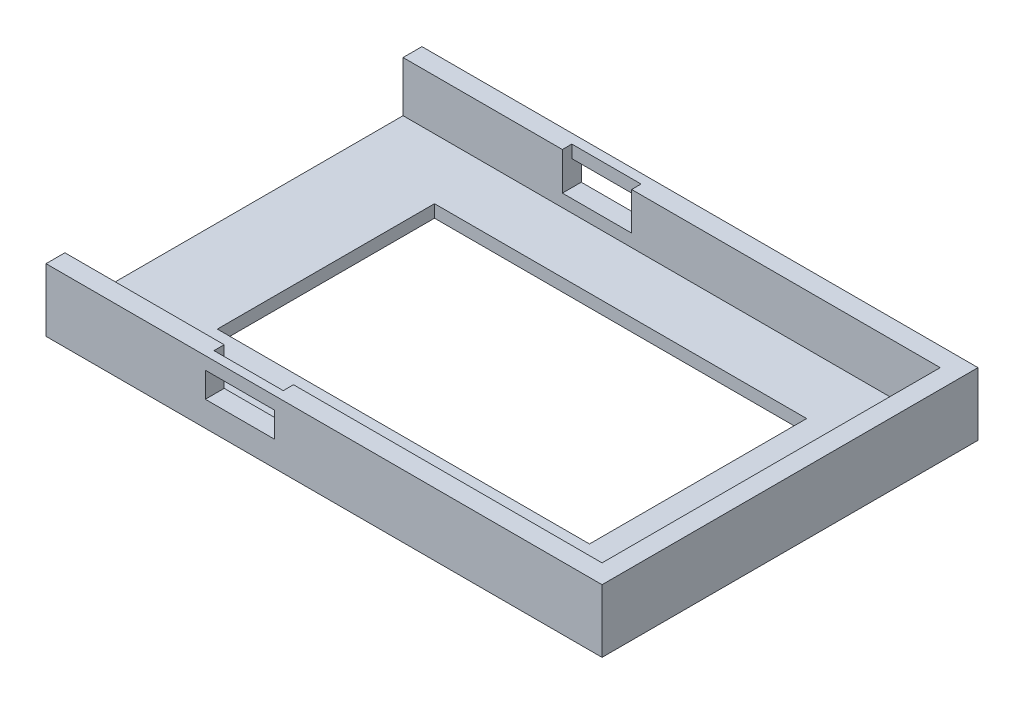
ISO-10303-21;
HEADER;
FILE_DESCRIPTION(('STEP AP214'),'2;1');
FILE_NAME('part.step','',(''),(''),'','','');
FILE_SCHEMA(('AUTOMOTIVE_DESIGN { 1 0 10303 214 1 1 1 1 }'));
ENDSEC;
DATA;
#1=APPLICATION_CONTEXT('core data for automotive mechanical design processes');
#2=APPLICATION_PROTOCOL_DEFINITION('international standard','automotive_design',2000,#1);
#3=PRODUCT_CONTEXT('',#1,'mechanical');
#4=PRODUCT('Part','Part','',(#3));
#5=PRODUCT_RELATED_PRODUCT_CATEGORY('part','',(#4));
#6=PRODUCT_DEFINITION_FORMATION('','',#4);
#7=PRODUCT_DEFINITION_CONTEXT('part definition',#1,'design');
#8=PRODUCT_DEFINITION('design','',#6,#7);
#9=PRODUCT_DEFINITION_SHAPE('','',#8);
#10=(LENGTH_UNIT() NAMED_UNIT(*) SI_UNIT(.MILLI.,.METRE.));
#11=(NAMED_UNIT(*) PLANE_ANGLE_UNIT() SI_UNIT($,.RADIAN.));
#12=(NAMED_UNIT(*) SI_UNIT($,.STERADIAN.) SOLID_ANGLE_UNIT());
#13=UNCERTAINTY_MEASURE_WITH_UNIT(LENGTH_MEASURE(1.E-05),#10,'distance_accuracy_value','');
#14=(GEOMETRIC_REPRESENTATION_CONTEXT(3) GLOBAL_UNCERTAINTY_ASSIGNED_CONTEXT((#13)) GLOBAL_UNIT_ASSIGNED_CONTEXT((#10,
#11,#12)) REPRESENTATION_CONTEXT('',''));
#15=CARTESIAN_POINT('',(0.,0.,0.));
#16=DIRECTION('',(0.,0.,1.));
#17=DIRECTION('',(1.,0.,0.));
#18=AXIS2_PLACEMENT_3D('',#15,#16,#17);
#19=CARTESIAN_POINT('',(-7.84999999999998,2.,-26.85));
#20=DIRECTION('',(1.,0.,0.));
#21=DIRECTION('',(0.,0.,-1.));
#22=AXIS2_PLACEMENT_3D('',#19,#20,#21);
#23=PLANE('',#22);
#24=DIRECTION('',(0.,1.,0.));
#25=VECTOR('',#24,1.);
#26=CARTESIAN_POINT('',(-7.84999999999998,8.,-28.35));
#27=LINE('',#26,#25);
#28=CARTESIAN_POINT('',(-7.84999999999998,6.,-28.35));
#29=VERTEX_POINT('',#28);
#30=CARTESIAN_POINT('',(-7.84999999999998,8.,-28.35));
#31=VERTEX_POINT('',#30);
#32=EDGE_CURVE('E211',#29,#31,#27,.T.);
#33=ORIENTED_EDGE('',*,*,#32,.F.);
#34=DIRECTION('',(0.,0.,1.));
#35=VECTOR('',#34,1.);
#36=CARTESIAN_POINT('',(-7.84999999999998,6.,-29.85));
#37=LINE('',#36,#35);
#38=CARTESIAN_POINT('',(-7.84999999999998,6.,-29.85));
#39=VERTEX_POINT('',#38);
#40=EDGE_CURVE('E220',#39,#29,#37,.T.);
#41=ORIENTED_EDGE('',*,*,#40,.F.);
#42=DIRECTION('',(0.,1.,0.));
#43=VECTOR('',#42,1.);
#44=CARTESIAN_POINT('',(-7.84999999999998,2.,-29.85));
#45=LINE('',#44,#43);
#46=CARTESIAN_POINT('',(-7.84999999999998,2.,-29.85));
#47=VERTEX_POINT('',#46);
#48=EDGE_CURVE('E237',#47,#39,#45,.T.);
#49=ORIENTED_EDGE('',*,*,#48,.F.);
#50=DIRECTION('',(0.,0.,-1.));
#51=VECTOR('',#50,1.);
#52=CARTESIAN_POINT('',(-7.84999999999998,2.,-26.85));
#53=LINE('',#52,#51);
#54=CARTESIAN_POINT('',(-7.84999999999998,2.,-26.85));
#55=VERTEX_POINT('',#54);
#56=EDGE_CURVE('E250',#55,#47,#53,.T.);
#57=ORIENTED_EDGE('',*,*,#56,.F.);
#58=DIRECTION('',(0.,1.,0.));
#59=VECTOR('',#58,1.);
#60=CARTESIAN_POINT('',(-7.84999999999998,2.,-26.85));
#61=LINE('',#60,#59);
#62=CARTESIAN_POINT('',(-7.84999999999998,8.,-26.85));
#63=VERTEX_POINT('',#62);
#64=EDGE_CURVE('E224',#55,#63,#61,.T.);
#65=ORIENTED_EDGE('',*,*,#64,.T.);
#66=DIRECTION('',(0.,0.,-1.));
#67=VECTOR('',#66,1.);
#68=CARTESIAN_POINT('',(-7.84999999999998,8.,-26.85));
#69=LINE('',#68,#67);
#70=EDGE_CURVE('E204',#63,#31,#69,.T.);
#71=ORIENTED_EDGE('',*,*,#70,.T.);
#72=EDGE_LOOP('',(#33,#41,#49,#57,#65,#71));
#73=FACE_BOUND('',#72,.T.);
#74=ADVANCED_FACE('F39',(#73),#23,.F.);
#75=CARTESIAN_POINT('',(-18.85,2.,-29.85));
#76=DIRECTION('',(-1.,0.,0.));
#77=DIRECTION('',(0.,0.,1.));
#78=AXIS2_PLACEMENT_3D('',#75,#76,#77);
#79=PLANE('',#78);
#80=DIRECTION('',(0.,1.,0.));
#81=VECTOR('',#80,1.);
#82=CARTESIAN_POINT('',(-18.85,8.,-28.35));
#83=LINE('',#82,#81);
#84=CARTESIAN_POINT('',(-18.85,6.,-28.35));
#85=VERTEX_POINT('',#84);
#86=CARTESIAN_POINT('',(-18.85,8.,-28.35));
#87=VERTEX_POINT('',#86);
#88=EDGE_CURVE('E451',#85,#87,#83,.T.);
#89=ORIENTED_EDGE('',*,*,#88,.T.);
#90=DIRECTION('',(0.,0.,1.));
#91=VECTOR('',#90,1.);
#92=CARTESIAN_POINT('',(-18.85,8.,-29.85));
#93=LINE('',#92,#91);
#94=CARTESIAN_POINT('',(-18.85,8.,-26.85));
#95=VERTEX_POINT('',#94);
#96=EDGE_CURVE('E207',#87,#95,#93,.T.);
#97=ORIENTED_EDGE('',*,*,#96,.T.);
#98=DIRECTION('',(0.,1.,0.));
#99=VECTOR('',#98,1.);
#100=CARTESIAN_POINT('',(-18.85,2.,-26.85));
#101=LINE('',#100,#99);
#102=CARTESIAN_POINT('',(-18.85,2.,-26.85));
#103=VERTEX_POINT('',#102);
#104=EDGE_CURVE('E244',#103,#95,#101,.T.);
#105=ORIENTED_EDGE('',*,*,#104,.F.);
#106=DIRECTION('',(0.,0.,1.));
#107=VECTOR('',#106,1.);
#108=CARTESIAN_POINT('',(-18.85,2.,-29.85));
#109=LINE('',#108,#107);
#110=CARTESIAN_POINT('',(-18.85,2.,-29.85));
#111=VERTEX_POINT('',#110);
#112=EDGE_CURVE('E231',#111,#103,#109,.T.);
#113=ORIENTED_EDGE('',*,*,#112,.F.);
#114=DIRECTION('',(0.,1.,0.));
#115=VECTOR('',#114,1.);
#116=CARTESIAN_POINT('',(-18.85,2.,-29.85));
#117=LINE('',#116,#115);
#118=CARTESIAN_POINT('',(-18.85,6.,-29.85));
#119=VERTEX_POINT('',#118);
#120=EDGE_CURVE('E60',#111,#119,#117,.T.);
#121=ORIENTED_EDGE('',*,*,#120,.T.);
#122=DIRECTION('',(0.,0.,1.));
#123=VECTOR('',#122,1.);
#124=CARTESIAN_POINT('',(-18.85,6.,-29.8499999999999));
#125=LINE('',#124,#123);
#126=EDGE_CURVE('E55',#119,#85,#125,.T.);
#127=ORIENTED_EDGE('',*,*,#126,.T.);
#128=EDGE_LOOP('',(#89,#97,#105,#113,#121,#127));
#129=FACE_BOUND('',#128,.T.);
#130=ADVANCED_FACE('F519',(#129),#79,.F.);
#131=CARTESIAN_POINT('',(-7.84999999999998,2.,26.85));
#132=DIRECTION('',(1.,0.,0.));
#133=DIRECTION('',(0.,0.,-1.));
#134=AXIS2_PLACEMENT_3D('',#131,#132,#133);
#135=PLANE('',#134);
#136=DIRECTION('',(0.,-1.,0.));
#137=VECTOR('',#136,1.);
#138=CARTESIAN_POINT('',(-7.84999999999998,8.,28.4745612654689));
#139=LINE('',#138,#137);
#140=CARTESIAN_POINT('',(-7.84999999999998,8.,28.4745612654689));
#141=VERTEX_POINT('',#140);
#142=CARTESIAN_POINT('',(-7.84999999999998,6.,28.4745612654689));
#143=VERTEX_POINT('',#142);
#144=EDGE_CURVE('E457',#141,#143,#139,.T.);
#145=ORIENTED_EDGE('',*,*,#144,.F.);
#146=DIRECTION('',(0.,0.,-1.));
#147=VECTOR('',#146,1.);
#148=CARTESIAN_POINT('',(-7.84999999999998,8.,26.85));
#149=LINE('',#148,#147);
#150=CARTESIAN_POINT('',(-7.84999999999998,8.,26.85));
#151=VERTEX_POINT('',#150);
#152=EDGE_CURVE('E256',#141,#151,#149,.T.);
#153=ORIENTED_EDGE('',*,*,#152,.T.);
#154=DIRECTION('',(0.,1.,0.));
#155=VECTOR('',#154,1.);
#156=CARTESIAN_POINT('',(-7.84999999999998,2.,26.85));
#157=LINE('',#156,#155);
#158=CARTESIAN_POINT('',(-7.84999999999998,2.,26.85));
#159=VERTEX_POINT('',#158);
#160=EDGE_CURVE('E233',#159,#151,#157,.T.);
#161=ORIENTED_EDGE('',*,*,#160,.F.);
#162=DIRECTION('',(0.,0.,-1.));
#163=VECTOR('',#162,1.);
#164=CARTESIAN_POINT('',(-7.84999999999998,2.,26.85));
#165=LINE('',#164,#163);
#166=CARTESIAN_POINT('',(-7.84999999999998,2.,29.85));
#167=VERTEX_POINT('',#166);
#168=EDGE_CURVE('E263',#167,#159,#165,.T.);
#169=ORIENTED_EDGE('',*,*,#168,.F.);
#170=DIRECTION('',(0.,1.,0.));
#171=VECTOR('',#170,1.);
#172=CARTESIAN_POINT('',(-7.84999999999998,2.,29.85));
#173=LINE('',#172,#171);
#174=CARTESIAN_POINT('',(-7.84999999999998,6.,29.85));
#175=VERTEX_POINT('',#174);
#176=EDGE_CURVE('E276',#167,#175,#173,.T.);
#177=ORIENTED_EDGE('',*,*,#176,.T.);
#178=DIRECTION('',(0.,0.,1.));
#179=VECTOR('',#178,1.);
#180=CARTESIAN_POINT('',(-7.84999999999998,6.,29.85));
#181=LINE('',#180,#179);
#182=EDGE_CURVE('E456',#143,#175,#181,.T.);
#183=ORIENTED_EDGE('',*,*,#182,.F.);
#184=EDGE_LOOP('',(#145,#153,#161,#169,#177,#183));
#185=FACE_BOUND('',#184,.T.);
#186=ADVANCED_FACE('F505',(#185),#135,.F.);
#187=CARTESIAN_POINT('',(-18.85,2.,29.85));
#188=DIRECTION('',(-1.,0.,0.));
#189=DIRECTION('',(0.,0.,1.));
#190=AXIS2_PLACEMENT_3D('',#187,#188,#189);
#191=PLANE('',#190);
#192=DIRECTION('',(0.,-1.,0.));
#193=VECTOR('',#192,1.);
#194=CARTESIAN_POINT('',(-18.85,8.,28.4745612654689));
#195=LINE('',#194,#193);
#196=CARTESIAN_POINT('',(-18.85,8.,28.4745612654689));
#197=VERTEX_POINT('',#196);
#198=CARTESIAN_POINT('',(-18.85,6.,28.4745612654689));
#199=VERTEX_POINT('',#198);
#200=EDGE_CURVE('E270',#197,#199,#195,.T.);
#201=ORIENTED_EDGE('',*,*,#200,.T.);
#202=DIRECTION('',(0.,0.,1.));
#203=VECTOR('',#202,1.);
#204=CARTESIAN_POINT('',(-18.85,6.,29.85));
#205=LINE('',#204,#203);
#206=CARTESIAN_POINT('',(-18.85,6.,29.85));
#207=VERTEX_POINT('',#206);
#208=EDGE_CURVE('E461',#199,#207,#205,.T.);
#209=ORIENTED_EDGE('',*,*,#208,.T.);
#210=DIRECTION('',(0.,1.,0.));
#211=VECTOR('',#210,1.);
#212=CARTESIAN_POINT('',(-18.85,2.,29.85));
#213=LINE('',#212,#211);
#214=CARTESIAN_POINT('',(-18.85,2.,29.85));
#215=VERTEX_POINT('',#214);
#216=EDGE_CURVE('E279',#215,#207,#213,.T.);
#217=ORIENTED_EDGE('',*,*,#216,.F.);
#218=DIRECTION('',(0.,0.,1.));
#219=VECTOR('',#218,1.);
#220=CARTESIAN_POINT('',(-18.85,2.,29.85));
#221=LINE('',#220,#219);
#222=CARTESIAN_POINT('',(-18.85,2.,26.85));
#223=VERTEX_POINT('',#222);
#224=EDGE_CURVE('E255',#223,#215,#221,.T.);
#225=ORIENTED_EDGE('',*,*,#224,.F.);
#226=DIRECTION('',(0.,1.,0.));
#227=VECTOR('',#226,1.);
#228=CARTESIAN_POINT('',(-18.85,2.,26.85));
#229=LINE('',#228,#227);
#230=CARTESIAN_POINT('',(-18.85,8.,26.85));
#231=VERTEX_POINT('',#230);
#232=EDGE_CURVE('E266',#223,#231,#229,.T.);
#233=ORIENTED_EDGE('',*,*,#232,.T.);
#234=DIRECTION('',(0.,0.,1.));
#235=VECTOR('',#234,1.);
#236=CARTESIAN_POINT('',(-18.85,8.,29.85));
#237=LINE('',#236,#235);
#238=EDGE_CURVE('E267',#231,#197,#237,.T.);
#239=ORIENTED_EDGE('',*,*,#238,.T.);
#240=EDGE_LOOP('',(#201,#209,#217,#225,#233,#239));
#241=FACE_BOUND('',#240,.T.);
#242=ADVANCED_FACE('F514',(#241),#191,.F.);
#243=CARTESIAN_POINT('',(0.,0.,0.));
#244=DIRECTION('',(0.,-1.,0.));
#245=DIRECTION('',(0.,0.,-1.));
#246=AXIS2_PLACEMENT_3D('',#243,#244,#245);
#247=PLANE('',#246);
#248=DIRECTION('',(0.,0.,-1.));
#249=VECTOR('',#248,1.);
#250=CARTESIAN_POINT('',(41.15,0.,26.85));
#251=LINE('',#250,#249);
#252=CARTESIAN_POINT('',(41.15,0.,26.85));
#253=VERTEX_POINT('',#252);
#254=CARTESIAN_POINT('',(41.15,0.,-26.85));
#255=VERTEX_POINT('',#254);
#256=EDGE_CURVE('E374',#253,#255,#251,.T.);
#257=ORIENTED_EDGE('',*,*,#256,.T.);
#258=DIRECTION('',(-1.,0.,0.));
#259=VECTOR('',#258,1.);
#260=CARTESIAN_POINT('',(-41.15,0.,-26.85));
#261=LINE('',#260,#259);
#262=CARTESIAN_POINT('',(-44.15,0.,-26.85));
#263=VERTEX_POINT('',#262);
#264=EDGE_CURVE('E378',#255,#263,#261,.T.);
#265=ORIENTED_EDGE('',*,*,#264,.T.);
#266=DIRECTION('',(0.,0.,1.));
#267=VECTOR('',#266,1.);
#268=CARTESIAN_POINT('',(-44.15,0.,-26.85));
#269=LINE('',#268,#267);
#270=CARTESIAN_POINT('',(-44.15,0.,26.85));
#271=VERTEX_POINT('',#270);
#272=EDGE_CURVE('E285',#263,#271,#269,.T.);
#273=ORIENTED_EDGE('',*,*,#272,.T.);
#274=DIRECTION('',(1.,0.,0.));
#275=VECTOR('',#274,1.);
#276=CARTESIAN_POINT('',(-41.15,0.,26.85));
#277=LINE('',#276,#275);
#278=EDGE_CURVE('E356',#271,#253,#277,.T.);
#279=ORIENTED_EDGE('',*,*,#278,.T.);
#280=EDGE_LOOP('',(#257,#265,#273,#279));
#281=FACE_BOUND('',#280,.T.);
#282=DIRECTION('',(0.,0.,1.));
#283=VECTOR('',#282,1.);
#284=CARTESIAN_POINT('',(-29.5497990147305,0.,17.2450065457483));
#285=LINE('',#284,#283);
#286=CARTESIAN_POINT('',(-29.5497990147305,0.,-17.2450065457483));
#287=VERTEX_POINT('',#286);
#288=CARTESIAN_POINT('',(-29.5497990147305,0.,17.2450065457483));
#289=VERTEX_POINT('',#288);
#290=EDGE_CURVE('E293',#287,#289,#285,.T.);
#291=ORIENTED_EDGE('',*,*,#290,.F.);
#292=DIRECTION('',(-1.,0.,0.));
#293=VECTOR('',#292,1.);
#294=CARTESIAN_POINT('',(-29.5497990147305,0.,-17.2450065457483));
#295=LINE('',#294,#293);
#296=CARTESIAN_POINT('',(29.5497990147305,0.,-17.2450065457483));
#297=VERTEX_POINT('',#296);
#298=EDGE_CURVE('E302',#297,#287,#295,.T.);
#299=ORIENTED_EDGE('',*,*,#298,.F.);
#300=DIRECTION('',(0.,0.,-1.));
#301=VECTOR('',#300,1.);
#302=CARTESIAN_POINT('',(29.5497990147305,0.,17.2450065457483));
#303=LINE('',#302,#301);
#304=CARTESIAN_POINT('',(29.5497990147305,0.,17.2450065457483));
#305=VERTEX_POINT('',#304);
#306=EDGE_CURVE('E322',#305,#297,#303,.T.);
#307=ORIENTED_EDGE('',*,*,#306,.F.);
#308=DIRECTION('',(1.,0.,0.));
#309=VECTOR('',#308,1.);
#310=CARTESIAN_POINT('',(-29.5497990147305,0.,17.2450065457483));
#311=LINE('',#310,#309);
#312=EDGE_CURVE('E318',#289,#305,#311,.T.);
#313=ORIENTED_EDGE('',*,*,#312,.F.);
#314=EDGE_LOOP('',(#291,#299,#307,#313));
#315=FACE_BOUND('',#314,.T.);
#316=ADVANCED_FACE('F517',(#281,#315),#247,.F.);
#317=CARTESIAN_POINT('',(0.,8.,0.));
#318=DIRECTION('',(0.,-1.,0.));
#319=DIRECTION('',(0.,0.,-1.));
#320=AXIS2_PLACEMENT_3D('',#317,#318,#319);
#321=PLANE('',#320);
#322=DIRECTION('',(1.,0.,0.));
#323=VECTOR('',#322,1.);
#324=CARTESIAN_POINT('',(-44.15,8.,29.85));
#325=LINE('',#324,#323);
#326=CARTESIAN_POINT('',(-44.15,8.,29.85));
#327=VERTEX_POINT('',#326);
#328=CARTESIAN_POINT('',(44.15,8.,29.85));
#329=VERTEX_POINT('',#328);
#330=EDGE_CURVE('E392',#327,#329,#325,.T.);
#331=ORIENTED_EDGE('',*,*,#330,.T.);
#332=DIRECTION('',(0.,0.,-1.));
#333=VECTOR('',#332,1.);
#334=CARTESIAN_POINT('',(44.15,8.,29.85));
#335=LINE('',#334,#333);
#336=CARTESIAN_POINT('',(44.15,8.,-29.85));
#337=VERTEX_POINT('',#336);
#338=EDGE_CURVE('E395',#329,#337,#335,.T.);
#339=ORIENTED_EDGE('',*,*,#338,.T.);
#340=DIRECTION('',(-1.,0.,0.));
#341=VECTOR('',#340,1.);
#342=CARTESIAN_POINT('',(-44.15,8.,-29.85));
#343=LINE('',#342,#341);
#344=CARTESIAN_POINT('',(-44.15,8.,-29.85));
#345=VERTEX_POINT('',#344);
#346=EDGE_CURVE('E398',#337,#345,#343,.T.);
#347=ORIENTED_EDGE('',*,*,#346,.T.);
#348=DIRECTION('',(0.,0.,1.));
#349=VECTOR('',#348,1.);
#350=CARTESIAN_POINT('',(-44.15,8.,29.85));
#351=LINE('',#350,#349);
#352=CARTESIAN_POINT('',(-44.15,8.,-26.85));
#353=VERTEX_POINT('',#352);
#354=EDGE_CURVE('E388',#345,#353,#351,.T.);
#355=ORIENTED_EDGE('',*,*,#354,.T.);
#356=DIRECTION('',(-1.,0.,0.));
#357=VECTOR('',#356,1.);
#358=CARTESIAN_POINT('',(-41.15,8.,-26.85));
#359=LINE('',#358,#357);
#360=EDGE_CURVE('E366',#95,#353,#359,.T.);
#361=ORIENTED_EDGE('',*,*,#360,.F.);
#362=ORIENTED_EDGE('',*,*,#96,.F.);
#363=DIRECTION('',(1.,0.,0.));
#364=VECTOR('',#363,1.);
#365=CARTESIAN_POINT('',(-44.152,8.,-28.35));
#366=LINE('',#365,#364);
#367=EDGE_CURVE('E199',#87,#31,#366,.T.);
#368=ORIENTED_EDGE('',*,*,#367,.T.);
#369=ORIENTED_EDGE('',*,*,#70,.F.);
#370=CARTESIAN_POINT('',(41.15,8.,-26.85));
#371=VERTEX_POINT('',#370);
#372=EDGE_CURVE('E367',#371,#63,#359,.T.);
#373=ORIENTED_EDGE('',*,*,#372,.F.);
#374=DIRECTION('',(0.,0.,-1.));
#375=VECTOR('',#374,1.);
#376=CARTESIAN_POINT('',(41.15,8.,26.85));
#377=LINE('',#376,#375);
#378=CARTESIAN_POINT('',(41.15,8.,26.85));
#379=VERTEX_POINT('',#378);
#380=EDGE_CURVE('E361',#379,#371,#377,.T.);
#381=ORIENTED_EDGE('',*,*,#380,.F.);
#382=DIRECTION('',(1.,0.,0.));
#383=VECTOR('',#382,1.);
#384=CARTESIAN_POINT('',(-41.15,8.,26.85));
#385=LINE('',#384,#383);
#386=EDGE_CURVE('E362',#151,#379,#385,.T.);
#387=ORIENTED_EDGE('',*,*,#386,.F.);
#388=ORIENTED_EDGE('',*,*,#152,.F.);
#389=DIRECTION('',(1.,0.,0.));
#390=VECTOR('',#389,1.);
#391=CARTESIAN_POINT('',(-21.2773095625504,8.,28.4745612654689));
#392=LINE('',#391,#390);
#393=EDGE_CURVE('E450',#197,#141,#392,.T.);
#394=ORIENTED_EDGE('',*,*,#393,.F.);
#395=ORIENTED_EDGE('',*,*,#238,.F.);
#396=CARTESIAN_POINT('',(-44.15,8.,26.85));
#397=VERTEX_POINT('',#396);
#398=EDGE_CURVE('E357',#397,#231,#385,.T.);
#399=ORIENTED_EDGE('',*,*,#398,.F.);
#400=EDGE_CURVE('E387',#397,#327,#351,.T.);
#401=ORIENTED_EDGE('',*,*,#400,.T.);
#402=EDGE_LOOP('',(#331,#339,#347,#355,#361,#362,#368,#369,#373,#381,#387,#388,#394,#395,#399,#401));
#403=FACE_BOUND('',#402,.T.);
#404=ADVANCED_FACE('F201',(#403),#321,.F.);
#405=CARTESIAN_POINT('',(-44.15,8.,29.85));
#406=DIRECTION('',(1.,0.,0.));
#407=DIRECTION('',(0.,0.,-1.));
#408=AXIS2_PLACEMENT_3D('',#405,#406,#407);
#409=PLANE('',#408);
#410=ORIENTED_EDGE('',*,*,#272,.F.);
#411=DIRECTION('',(0.,1.,0.));
#412=VECTOR('',#411,1.);
#413=CARTESIAN_POINT('',(-44.15,-53.7837336004112,-26.85));
#414=LINE('',#413,#412);
#415=EDGE_CURVE('E241',#263,#353,#414,.T.);
#416=ORIENTED_EDGE('',*,*,#415,.T.);
#417=ORIENTED_EDGE('',*,*,#354,.F.);
#418=DIRECTION('',(0.,-1.,0.));
#419=VECTOR('',#418,1.);
#420=CARTESIAN_POINT('',(-44.15,8.,-29.85));
#421=LINE('',#420,#419);
#422=CARTESIAN_POINT('',(-44.15,-2.,-29.85));
#423=VERTEX_POINT('',#422);
#424=EDGE_CURVE('E401',#345,#423,#421,.T.);
#425=ORIENTED_EDGE('',*,*,#424,.T.);
#426=DIRECTION('',(0.,0.,-1.));
#427=VECTOR('',#426,1.);
#428=CARTESIAN_POINT('',(-44.15,-2.,29.85));
#429=LINE('',#428,#427);
#430=CARTESIAN_POINT('',(-44.15,-2.,29.85));
#431=VERTEX_POINT('',#430);
#432=EDGE_CURVE('E331',#431,#423,#429,.T.);
#433=ORIENTED_EDGE('',*,*,#432,.F.);
#434=DIRECTION('',(0.,-1.,0.));
#435=VECTOR('',#434,1.);
#436=CARTESIAN_POINT('',(-44.15,8.,29.85));
#437=LINE('',#436,#435);
#438=EDGE_CURVE('E11',#327,#431,#437,.T.);
#439=ORIENTED_EDGE('',*,*,#438,.F.);
#440=ORIENTED_EDGE('',*,*,#400,.F.);
#441=DIRECTION('',(0.,1.,0.));
#442=VECTOR('',#441,1.);
#443=CARTESIAN_POINT('',(-44.15,-53.7837336004112,26.85));
#444=LINE('',#443,#442);
#445=EDGE_CURVE('E289',#271,#397,#444,.T.);
#446=ORIENTED_EDGE('',*,*,#445,.F.);
#447=EDGE_LOOP('',(#410,#416,#417,#425,#433,#439,#440,#446));
#448=FACE_BOUND('',#447,.T.);
#449=ADVANCED_FACE('F41',(#448),#409,.F.);
#450=CARTESIAN_POINT('',(-44.15,8.,29.85));
#451=DIRECTION('',(0.,0.,-1.));
#452=DIRECTION('',(-1.,0.,0.));
#453=AXIS2_PLACEMENT_3D('',#450,#451,#452);
#454=PLANE('',#453);
#455=DIRECTION('',(0.,-1.,0.));
#456=VECTOR('',#455,1.);
#457=CARTESIAN_POINT('',(44.15,8.,29.85));
#458=LINE('',#457,#456);
#459=CARTESIAN_POINT('',(44.15,-2.,29.85));
#460=VERTEX_POINT('',#459);
#461=EDGE_CURVE('E48',#329,#460,#458,.T.);
#462=ORIENTED_EDGE('',*,*,#461,.F.);
#463=ORIENTED_EDGE('',*,*,#330,.F.);
#464=ORIENTED_EDGE('',*,*,#438,.T.);
#465=DIRECTION('',(-1.,0.,0.));
#466=VECTOR('',#465,1.);
#467=CARTESIAN_POINT('',(-44.15,-2.,29.85));
#468=LINE('',#467,#466);
#469=EDGE_CURVE('E352',#460,#431,#468,.T.);
#470=ORIENTED_EDGE('',*,*,#469,.F.);
#471=EDGE_LOOP('',(#462,#463,#464,#470));
#472=FACE_BOUND('',#471,.T.);
#473=DIRECTION('',(1.,0.,0.));
#474=VECTOR('',#473,1.);
#475=CARTESIAN_POINT('',(-21.2773095625504,6.,29.85));
#476=LINE('',#475,#474);
#477=EDGE_CURVE('E446',#207,#175,#476,.T.);
#478=ORIENTED_EDGE('',*,*,#477,.T.);
#479=ORIENTED_EDGE('',*,*,#176,.F.);
#480=DIRECTION('',(1.,0.,0.));
#481=VECTOR('',#480,1.);
#482=CARTESIAN_POINT('',(-7.84999999999998,2.,29.85));
#483=LINE('',#482,#481);
#484=EDGE_CURVE('E260',#215,#167,#483,.T.);
#485=ORIENTED_EDGE('',*,*,#484,.F.);
#486=ORIENTED_EDGE('',*,*,#216,.T.);
#487=EDGE_LOOP('',(#478,#479,#485,#486));
#488=FACE_BOUND('',#487,.T.);
#489=ADVANCED_FACE('F420',(#472,#488),#454,.F.);
#490=CARTESIAN_POINT('',(44.15,8.,29.85));
#491=DIRECTION('',(-1.,0.,0.));
#492=DIRECTION('',(0.,0.,1.));
#493=AXIS2_PLACEMENT_3D('',#490,#491,#492);
#494=PLANE('',#493);
#495=ORIENTED_EDGE('',*,*,#461,.T.);
#496=DIRECTION('',(0.,0.,1.));
#497=VECTOR('',#496,1.);
#498=CARTESIAN_POINT('',(44.15,-2.,29.85));
#499=LINE('',#498,#497);
#500=CARTESIAN_POINT('',(44.15,-2.,-29.85));
#501=VERTEX_POINT('',#500);
#502=EDGE_CURVE('E348',#501,#460,#499,.T.);
#503=ORIENTED_EDGE('',*,*,#502,.F.);
#504=DIRECTION('',(0.,-1.,0.));
#505=VECTOR('',#504,1.);
#506=CARTESIAN_POINT('',(44.15,8.,-29.85));
#507=LINE('',#506,#505);
#508=EDGE_CURVE('E404',#337,#501,#507,.T.);
#509=ORIENTED_EDGE('',*,*,#508,.F.);
#510=ORIENTED_EDGE('',*,*,#338,.F.);
#511=EDGE_LOOP('',(#495,#503,#509,#510));
#512=FACE_BOUND('',#511,.T.);
#513=ADVANCED_FACE('F411',(#512),#494,.F.);
#514=CARTESIAN_POINT('',(-44.15,8.,-29.85));
#515=DIRECTION('',(0.,0.,1.));
#516=DIRECTION('',(1.,0.,0.));
#517=AXIS2_PLACEMENT_3D('',#514,#515,#516);
#518=PLANE('',#517);
#519=ORIENTED_EDGE('',*,*,#48,.T.);
#520=DIRECTION('',(1.,0.,0.));
#521=VECTOR('',#520,1.);
#522=CARTESIAN_POINT('',(-44.152,6.,-29.85));
#523=LINE('',#522,#521);
#524=EDGE_CURVE('E474',#119,#39,#523,.T.);
#525=ORIENTED_EDGE('',*,*,#524,.F.);
#526=ORIENTED_EDGE('',*,*,#120,.F.);
#527=DIRECTION('',(-1.,0.,0.));
#528=VECTOR('',#527,1.);
#529=CARTESIAN_POINT('',(-7.84999999999998,2.,-29.85));
#530=LINE('',#529,#528);
#531=EDGE_CURVE('E226',#47,#111,#530,.T.);
#532=ORIENTED_EDGE('',*,*,#531,.F.);
#533=EDGE_LOOP('',(#519,#525,#526,#532));
#534=FACE_BOUND('',#533,.T.);
#535=ORIENTED_EDGE('',*,*,#424,.F.);
#536=ORIENTED_EDGE('',*,*,#346,.F.);
#537=ORIENTED_EDGE('',*,*,#508,.T.);
#538=DIRECTION('',(1.,0.,0.));
#539=VECTOR('',#538,1.);
#540=CARTESIAN_POINT('',(-44.15,-2.,-29.85));
#541=LINE('',#540,#539);
#542=EDGE_CURVE('E344',#423,#501,#541,.T.);
#543=ORIENTED_EDGE('',*,*,#542,.F.);
#544=EDGE_LOOP('',(#535,#536,#537,#543));
#545=FACE_BOUND('',#544,.T.);
#546=ADVANCED_FACE('F431',(#534,#545),#518,.F.);
#547=CARTESIAN_POINT('',(-41.15,8.,26.85));
#548=DIRECTION('',(0.,0.,-1.));
#549=DIRECTION('',(-1.,0.,0.));
#550=AXIS2_PLACEMENT_3D('',#547,#548,#549);
#551=PLANE('',#550);
#552=ORIENTED_EDGE('',*,*,#160,.T.);
#553=ORIENTED_EDGE('',*,*,#386,.T.);
#554=DIRECTION('',(0.,-1.,0.));
#555=VECTOR('',#554,1.);
#556=CARTESIAN_POINT('',(41.15,8.,26.85));
#557=LINE('',#556,#555);
#558=EDGE_CURVE('E384',#379,#253,#557,.T.);
#559=ORIENTED_EDGE('',*,*,#558,.T.);
#560=ORIENTED_EDGE('',*,*,#278,.F.);
#561=ORIENTED_EDGE('',*,*,#445,.T.);
#562=ORIENTED_EDGE('',*,*,#398,.T.);
#563=ORIENTED_EDGE('',*,*,#232,.F.);
#564=DIRECTION('',(-1.,0.,0.));
#565=VECTOR('',#564,1.);
#566=CARTESIAN_POINT('',(-18.85,2.,26.85));
#567=LINE('',#566,#565);
#568=EDGE_CURVE('E251',#159,#223,#567,.T.);
#569=ORIENTED_EDGE('',*,*,#568,.F.);
#570=EDGE_LOOP('',(#552,#553,#559,#560,#561,#562,#563,#569));
#571=FACE_BOUND('',#570,.T.);
#572=ADVANCED_FACE('F499',(#571),#551,.T.);
#573=CARTESIAN_POINT('',(41.15,8.,26.85));
#574=DIRECTION('',(-1.,0.,0.));
#575=DIRECTION('',(0.,0.,1.));
#576=AXIS2_PLACEMENT_3D('',#573,#574,#575);
#577=PLANE('',#576);
#578=ORIENTED_EDGE('',*,*,#256,.F.);
#579=ORIENTED_EDGE('',*,*,#558,.F.);
#580=ORIENTED_EDGE('',*,*,#380,.T.);
#581=DIRECTION('',(0.,-1.,0.));
#582=VECTOR('',#581,1.);
#583=CARTESIAN_POINT('',(41.15,8.,-26.85));
#584=LINE('',#583,#582);
#585=EDGE_CURVE('E370',#371,#255,#584,.T.);
#586=ORIENTED_EDGE('',*,*,#585,.T.);
#587=EDGE_LOOP('',(#578,#579,#580,#586));
#588=FACE_BOUND('',#587,.T.);
#589=ADVANCED_FACE('F497',(#588),#577,.T.);
#590=CARTESIAN_POINT('',(-41.15,8.,-26.85));
#591=DIRECTION('',(0.,0.,1.));
#592=DIRECTION('',(1.,0.,0.));
#593=AXIS2_PLACEMENT_3D('',#590,#591,#592);
#594=PLANE('',#593);
#595=ORIENTED_EDGE('',*,*,#64,.F.);
#596=DIRECTION('',(1.,0.,0.));
#597=VECTOR('',#596,1.);
#598=CARTESIAN_POINT('',(-18.85,2.,-26.85));
#599=LINE('',#598,#597);
#600=EDGE_CURVE('E439',#103,#55,#599,.T.);
#601=ORIENTED_EDGE('',*,*,#600,.F.);
#602=ORIENTED_EDGE('',*,*,#104,.T.);
#603=ORIENTED_EDGE('',*,*,#360,.T.);
#604=ORIENTED_EDGE('',*,*,#415,.F.);
#605=ORIENTED_EDGE('',*,*,#264,.F.);
#606=ORIENTED_EDGE('',*,*,#585,.F.);
#607=ORIENTED_EDGE('',*,*,#372,.T.);
#608=EDGE_LOOP('',(#595,#601,#602,#603,#604,#605,#606,#607));
#609=FACE_BOUND('',#608,.T.);
#610=ADVANCED_FACE('F490',(#609),#594,.T.);
#611=CARTESIAN_POINT('',(0.,-2.,0.));
#612=DIRECTION('',(0.,-1.,0.));
#613=DIRECTION('',(0.,0.,-1.));
#614=AXIS2_PLACEMENT_3D('',#611,#612,#613);
#615=PLANE('',#614);
#616=DIRECTION('',(0.,0.,1.));
#617=VECTOR('',#616,1.);
#618=CARTESIAN_POINT('',(-29.5497990147305,-2.,17.2450065457483));
#619=LINE('',#618,#617);
#620=CARTESIAN_POINT('',(-29.5497990147305,-2.,-17.2450065457483));
#621=VERTEX_POINT('',#620);
#622=CARTESIAN_POINT('',(-29.5497990147305,-2.,17.2450065457483));
#623=VERTEX_POINT('',#622);
#624=EDGE_CURVE('E297',#621,#623,#619,.T.);
#625=ORIENTED_EDGE('',*,*,#624,.T.);
#626=DIRECTION('',(1.,0.,0.));
#627=VECTOR('',#626,1.);
#628=CARTESIAN_POINT('',(-29.5497990147305,-2.,17.2450065457483));
#629=LINE('',#628,#627);
#630=CARTESIAN_POINT('',(29.5497990147305,-2.,17.2450065457483));
#631=VERTEX_POINT('',#630);
#632=EDGE_CURVE('E301',#623,#631,#629,.T.);
#633=ORIENTED_EDGE('',*,*,#632,.T.);
#634=DIRECTION('',(0.,0.,-1.));
#635=VECTOR('',#634,1.);
#636=CARTESIAN_POINT('',(29.5497990147305,-2.,17.2450065457483));
#637=LINE('',#636,#635);
#638=CARTESIAN_POINT('',(29.5497990147305,-2.,-17.2450065457483));
#639=VERTEX_POINT('',#638);
#640=EDGE_CURVE('E306',#631,#639,#637,.T.);
#641=ORIENTED_EDGE('',*,*,#640,.T.);
#642=DIRECTION('',(-1.,0.,0.));
#643=VECTOR('',#642,1.);
#644=CARTESIAN_POINT('',(-29.5497990147305,-2.,-17.2450065457483));
#645=LINE('',#644,#643);
#646=EDGE_CURVE('E310',#639,#621,#645,.T.);
#647=ORIENTED_EDGE('',*,*,#646,.T.);
#648=EDGE_LOOP('',(#625,#633,#641,#647));
#649=FACE_BOUND('',#648,.T.);
#650=ORIENTED_EDGE('',*,*,#432,.T.);
#651=ORIENTED_EDGE('',*,*,#542,.T.);
#652=ORIENTED_EDGE('',*,*,#502,.T.);
#653=ORIENTED_EDGE('',*,*,#469,.T.);
#654=EDGE_LOOP('',(#650,#651,#652,#653));
#655=FACE_BOUND('',#654,.T.);
#656=ADVANCED_FACE('F417',(#649,#655),#615,.T.);
#657=CARTESIAN_POINT('',(-29.5497990147305,-2.,17.2450065457483));
#658=DIRECTION('',(-1.,0.,0.));
#659=DIRECTION('',(0.,0.,1.));
#660=AXIS2_PLACEMENT_3D('',#657,#658,#659);
#661=PLANE('',#660);
#662=ORIENTED_EDGE('',*,*,#290,.T.);
#663=DIRECTION('',(0.,1.,0.));
#664=VECTOR('',#663,1.);
#665=CARTESIAN_POINT('',(-29.5497990147305,-2.,17.2450065457483));
#666=LINE('',#665,#664);
#667=EDGE_CURVE('E314',#623,#289,#666,.T.);
#668=ORIENTED_EDGE('',*,*,#667,.F.);
#669=ORIENTED_EDGE('',*,*,#624,.F.);
#670=DIRECTION('',(0.,1.,0.));
#671=VECTOR('',#670,1.);
#672=CARTESIAN_POINT('',(-29.5497990147305,-2.,-17.2450065457483));
#673=LINE('',#672,#671);
#674=EDGE_CURVE('E328',#621,#287,#673,.T.);
#675=ORIENTED_EDGE('',*,*,#674,.T.);
#676=EDGE_LOOP('',(#662,#668,#669,#675));
#677=FACE_BOUND('',#676,.T.);
#678=ADVANCED_FACE('F540',(#677),#661,.F.);
#679=CARTESIAN_POINT('',(-29.5497990147305,-2.,-17.2450065457483));
#680=DIRECTION('',(0.,0.,-1.));
#681=DIRECTION('',(-1.,0.,0.));
#682=AXIS2_PLACEMENT_3D('',#679,#680,#681);
#683=PLANE('',#682);
#684=ORIENTED_EDGE('',*,*,#298,.T.);
#685=ORIENTED_EDGE('',*,*,#674,.F.);
#686=ORIENTED_EDGE('',*,*,#646,.F.);
#687=DIRECTION('',(0.,1.,0.));
#688=VECTOR('',#687,1.);
#689=CARTESIAN_POINT('',(29.5497990147305,-2.,-17.2450065457483));
#690=LINE('',#689,#688);
#691=EDGE_CURVE('E332',#639,#297,#690,.T.);
#692=ORIENTED_EDGE('',*,*,#691,.T.);
#693=EDGE_LOOP('',(#684,#685,#686,#692));
#694=FACE_BOUND('',#693,.T.);
#695=ADVANCED_FACE('F536',(#694),#683,.F.);
#696=CARTESIAN_POINT('',(29.5497990147305,-2.,17.2450065457483));
#697=DIRECTION('',(1.,0.,0.));
#698=DIRECTION('',(0.,0.,-1.));
#699=AXIS2_PLACEMENT_3D('',#696,#697,#698);
#700=PLANE('',#699);
#701=ORIENTED_EDGE('',*,*,#306,.T.);
#702=ORIENTED_EDGE('',*,*,#691,.F.);
#703=ORIENTED_EDGE('',*,*,#640,.F.);
#704=DIRECTION('',(0.,1.,0.));
#705=VECTOR('',#704,1.);
#706=CARTESIAN_POINT('',(29.5497990147305,-2.,17.2450065457483));
#707=LINE('',#706,#705);
#708=EDGE_CURVE('E336',#631,#305,#707,.T.);
#709=ORIENTED_EDGE('',*,*,#708,.T.);
#710=EDGE_LOOP('',(#701,#702,#703,#709));
#711=FACE_BOUND('',#710,.T.);
#712=ADVANCED_FACE('F539',(#711),#700,.F.);
#713=CARTESIAN_POINT('',(-29.5497990147305,-2.,17.2450065457483));
#714=DIRECTION('',(0.,0.,1.));
#715=DIRECTION('',(1.,0.,0.));
#716=AXIS2_PLACEMENT_3D('',#713,#714,#715);
#717=PLANE('',#716);
#718=ORIENTED_EDGE('',*,*,#312,.T.);
#719=ORIENTED_EDGE('',*,*,#708,.F.);
#720=ORIENTED_EDGE('',*,*,#632,.F.);
#721=ORIENTED_EDGE('',*,*,#667,.T.);
#722=EDGE_LOOP('',(#718,#719,#720,#721));
#723=FACE_BOUND('',#722,.T.);
#724=ADVANCED_FACE('F544',(#723),#717,.F.);
#725=CARTESIAN_POINT('',(0.,2.,0.));
#726=DIRECTION('',(0.,1.,0.));
#727=DIRECTION('',(0.,0.,1.));
#728=AXIS2_PLACEMENT_3D('',#725,#726,#727);
#729=PLANE('',#728);
#730=ORIENTED_EDGE('',*,*,#531,.T.);
#731=ORIENTED_EDGE('',*,*,#112,.T.);
#732=ORIENTED_EDGE('',*,*,#600,.T.);
#733=ORIENTED_EDGE('',*,*,#56,.T.);
#734=EDGE_LOOP('',(#730,#731,#732,#733));
#735=FACE_BOUND('',#734,.T.);
#736=ADVANCED_FACE('F487',(#735),#729,.T.);
#737=CARTESIAN_POINT('',(0.,2.,0.));
#738=DIRECTION('',(0.,-1.,0.));
#739=DIRECTION('',(0.,0.,-1.));
#740=AXIS2_PLACEMENT_3D('',#737,#738,#739);
#741=PLANE('',#740);
#742=ORIENTED_EDGE('',*,*,#568,.T.);
#743=ORIENTED_EDGE('',*,*,#224,.T.);
#744=ORIENTED_EDGE('',*,*,#484,.T.);
#745=ORIENTED_EDGE('',*,*,#168,.T.);
#746=EDGE_LOOP('',(#742,#743,#744,#745));
#747=FACE_BOUND('',#746,.T.);
#748=ADVANCED_FACE('F530',(#747),#741,.F.);
#749=CARTESIAN_POINT('',(-21.2773095625504,8.,28.4745612654689));
#750=DIRECTION('',(0.,0.,1.));
#751=DIRECTION('',(1.,0.,0.));
#752=AXIS2_PLACEMENT_3D('',#749,#750,#751);
#753=PLANE('',#752);
#754=ORIENTED_EDGE('',*,*,#200,.F.);
#755=ORIENTED_EDGE('',*,*,#393,.T.);
#756=ORIENTED_EDGE('',*,*,#144,.T.);
#757=DIRECTION('',(1.,0.,0.));
#758=VECTOR('',#757,1.);
#759=CARTESIAN_POINT('',(-21.2773095625504,6.,28.4745612654689));
#760=LINE('',#759,#758);
#761=EDGE_CURVE('E452',#199,#143,#760,.T.);
#762=ORIENTED_EDGE('',*,*,#761,.F.);
#763=EDGE_LOOP('',(#754,#755,#756,#762));
#764=FACE_BOUND('',#763,.T.);
#765=ADVANCED_FACE('F510',(#764),#753,.F.);
#766=CARTESIAN_POINT('',(-21.2773095625504,6.,29.85));
#767=DIRECTION('',(0.,1.,0.));
#768=DIRECTION('',(0.,0.,1.));
#769=AXIS2_PLACEMENT_3D('',#766,#767,#768);
#770=PLANE('',#769);
#771=ORIENTED_EDGE('',*,*,#208,.F.);
#772=ORIENTED_EDGE('',*,*,#761,.T.);
#773=ORIENTED_EDGE('',*,*,#182,.T.);
#774=ORIENTED_EDGE('',*,*,#477,.F.);
#775=EDGE_LOOP('',(#771,#772,#773,#774));
#776=FACE_BOUND('',#775,.T.);
#777=ADVANCED_FACE('F719',(#776),#770,.F.);
#778=CARTESIAN_POINT('',(-44.152,8.,-28.35));
#779=DIRECTION('',(0.,0.,-1.));
#780=DIRECTION('',(-1.,0.,0.));
#781=AXIS2_PLACEMENT_3D('',#778,#779,#780);
#782=PLANE('',#781);
#783=ORIENTED_EDGE('',*,*,#88,.F.);
#784=DIRECTION('',(1.,0.,0.));
#785=VECTOR('',#784,1.);
#786=CARTESIAN_POINT('',(-44.152,6.,-28.35));
#787=LINE('',#786,#785);
#788=EDGE_CURVE('E210',#85,#29,#787,.T.);
#789=ORIENTED_EDGE('',*,*,#788,.T.);
#790=ORIENTED_EDGE('',*,*,#32,.T.);
#791=ORIENTED_EDGE('',*,*,#367,.F.);
#792=EDGE_LOOP('',(#783,#789,#790,#791));
#793=FACE_BOUND('',#792,.T.);
#794=ADVANCED_FACE('F214',(#793),#782,.F.);
#795=CARTESIAN_POINT('',(-44.152,6.,-29.85));
#796=DIRECTION('',(0.,1.,0.));
#797=DIRECTION('',(0.,0.,1.));
#798=AXIS2_PLACEMENT_3D('',#795,#796,#797);
#799=PLANE('',#798);
#800=ORIENTED_EDGE('',*,*,#126,.F.);
#801=ORIENTED_EDGE('',*,*,#524,.T.);
#802=ORIENTED_EDGE('',*,*,#40,.T.);
#803=ORIENTED_EDGE('',*,*,#788,.F.);
#804=EDGE_LOOP('',(#800,#801,#802,#803));
#805=FACE_BOUND('',#804,.T.);
#806=ADVANCED_FACE('F483',(#805),#799,.F.);
#807=CLOSED_SHELL('',(#74,#130,#186,#242,#316,#404,#449,#489,#513,#546,#572,#589,#610,#656,#678,
#695,#712,#724,#736,#748,#765,#777,#794,#806));
#808=MANIFOLD_SOLID_BREP('B2',#807);
#809=ADVANCED_BREP_SHAPE_REPRESENTATION('',(#18,#808),#14);
#810=SHAPE_DEFINITION_REPRESENTATION(#9,#809);
ENDSEC;
END-ISO-10303-21;
